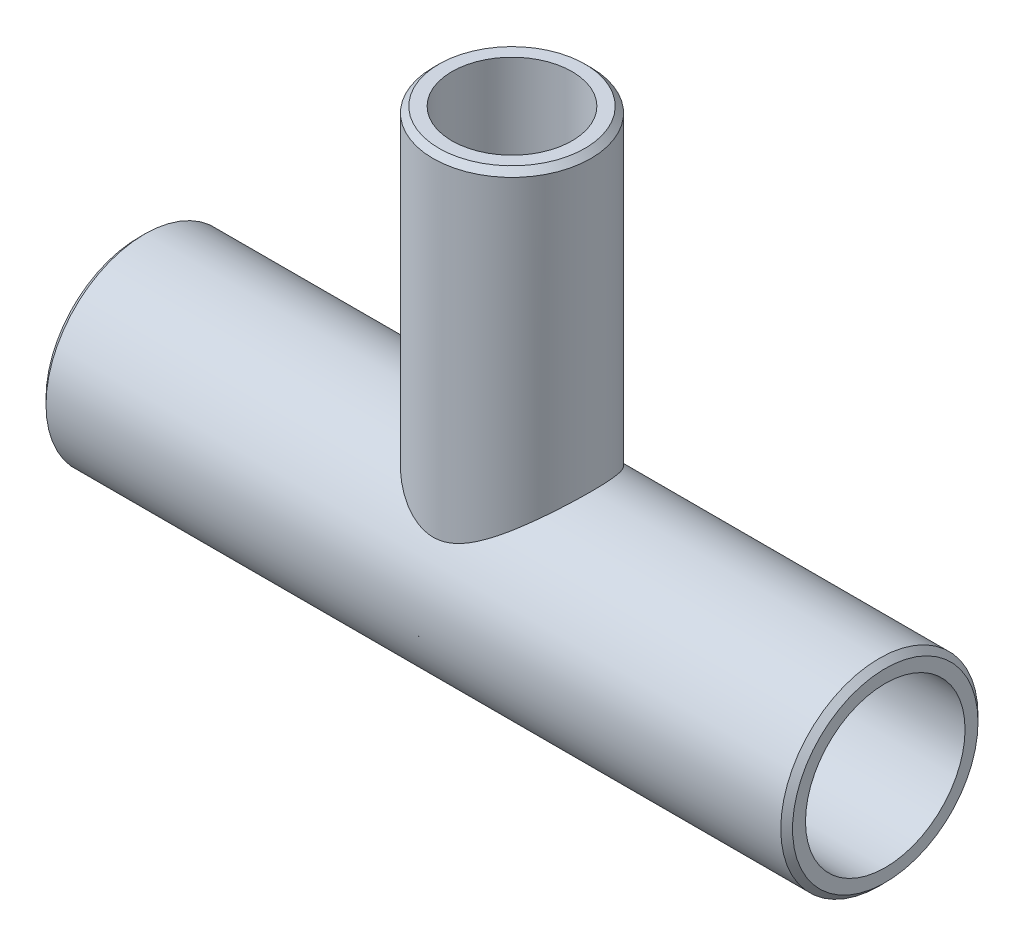
ISO-10303-21;
HEADER;
FILE_DESCRIPTION(('STEP AP214'),'2;1');
FILE_NAME('part.step','',(''),(''),'','','');
FILE_SCHEMA(('AUTOMOTIVE_DESIGN { 1 0 10303 214 1 1 1 1 }'));
ENDSEC;
DATA;
#1=APPLICATION_CONTEXT('core data for automotive mechanical design processes');
#2=APPLICATION_PROTOCOL_DEFINITION('international standard','automotive_design',2000,#1);
#3=PRODUCT_CONTEXT('',#1,'mechanical');
#4=PRODUCT('Part','Part','',(#3));
#5=PRODUCT_RELATED_PRODUCT_CATEGORY('part','',(#4));
#6=PRODUCT_DEFINITION_FORMATION('','',#4);
#7=PRODUCT_DEFINITION_CONTEXT('part definition',#1,'design');
#8=PRODUCT_DEFINITION('design','',#6,#7);
#9=PRODUCT_DEFINITION_SHAPE('','',#8);
#10=(LENGTH_UNIT() NAMED_UNIT(*) SI_UNIT(.MILLI.,.METRE.));
#11=(NAMED_UNIT(*) PLANE_ANGLE_UNIT() SI_UNIT($,.RADIAN.));
#12=(NAMED_UNIT(*) SI_UNIT($,.STERADIAN.) SOLID_ANGLE_UNIT());
#13=UNCERTAINTY_MEASURE_WITH_UNIT(LENGTH_MEASURE(1.E-05),#10,'distance_accuracy_value','');
#14=(GEOMETRIC_REPRESENTATION_CONTEXT(3) GLOBAL_UNCERTAINTY_ASSIGNED_CONTEXT((#13)) GLOBAL_UNIT_ASSIGNED_CONTEXT((#10,
#11,#12)) REPRESENTATION_CONTEXT('',''));
#15=CARTESIAN_POINT('',(0.,0.,0.));
#16=DIRECTION('',(0.,0.,1.));
#17=DIRECTION('',(1.,0.,0.));
#18=AXIS2_PLACEMENT_3D('',#15,#16,#17);
#19=CARTESIAN_POINT('',(-63.4,0.,0.));
#20=DIRECTION('',(-1.,0.,0.));
#21=DIRECTION('',(0.,0.,-1.));
#22=AXIS2_PLACEMENT_3D('',#19,#20,#21);
#23=PLANE('',#22);
#24=CARTESIAN_POINT('',(-63.4,0.,0.));
#25=DIRECTION('',(-1.,0.,0.));
#26=DIRECTION('',(0.,0.,1.));
#27=AXIS2_PLACEMENT_3D('',#24,#25,#26);
#28=CIRCLE('',#27,15.75);
#29=CARTESIAN_POINT('',(-63.4,0.,15.75));
#30=VERTEX_POINT('',#29);
#31=EDGE_CURVE('E10',#30,#30,#28,.T.);
#32=ORIENTED_EDGE('',*,*,#31,.T.);
#33=EDGE_LOOP('',(#32));
#34=FACE_BOUND('',#33,.T.);
#35=CARTESIAN_POINT('',(-63.4,0.,0.));
#36=DIRECTION('',(-1.,0.,0.));
#37=DIRECTION('',(0.,0.,1.));
#38=AXIS2_PLACEMENT_3D('',#35,#36,#37);
#39=CIRCLE('',#38,13.55);
#40=CARTESIAN_POINT('',(-63.4,0.,13.55));
#41=VERTEX_POINT('',#40);
#42=EDGE_CURVE('E93',#41,#41,#39,.F.);
#43=ORIENTED_EDGE('',*,*,#42,.T.);
#44=EDGE_LOOP('',(#43));
#45=FACE_BOUND('',#44,.T.);
#46=ADVANCED_FACE('F32',(#34,#45),#23,.T.);
#47=CARTESIAN_POINT('',(63.4,0.,0.));
#48=DIRECTION('',(-1.,0.,0.));
#49=DIRECTION('',(0.,0.,1.));
#50=AXIS2_PLACEMENT_3D('',#47,#48,#49);
#51=CYLINDRICAL_SURFACE('',#50,16.75);
#52=CARTESIAN_POINT('',(62.4,0.,0.));
#53=DIRECTION('',(1.,0.,0.));
#54=DIRECTION('',(0.,0.,-1.));
#55=AXIS2_PLACEMENT_3D('',#52,#53,#54);
#56=CIRCLE('',#55,16.75);
#57=CARTESIAN_POINT('',(62.4,0.,-16.75));
#58=VERTEX_POINT('',#57);
#59=EDGE_CURVE('E39',#58,#58,#56,.F.);
#60=ORIENTED_EDGE('',*,*,#59,.T.);
#61=EDGE_LOOP('',(#60));
#62=FACE_BOUND('',#61,.T.);
#63=CARTESIAN_POINT('',(-62.4,0.,0.));
#64=DIRECTION('',(-1.,0.,0.));
#65=DIRECTION('',(0.,0.,1.));
#66=AXIS2_PLACEMENT_3D('',#63,#64,#65);
#67=CIRCLE('',#66,16.75);
#68=CARTESIAN_POINT('',(-62.4,0.,16.75));
#69=VERTEX_POINT('',#68);
#70=EDGE_CURVE('E43',#69,#69,#67,.F.);
#71=ORIENTED_EDGE('',*,*,#70,.T.);
#72=EDGE_LOOP('',(#71));
#73=FACE_BOUND('',#72,.T.);
#74=CARTESIAN_POINT('',(0.,10.05,-13.4));
#75=CARTESIAN_POINT('',(-0.251626201327956,10.0500059696271,-13.3999974965364));
#76=CARTESIAN_POINT('',(-0.503344424185759,10.0594974422922,-13.3928931752002));
#77=CARTESIAN_POINT('',(-1.00470312417824,10.0969954885486,-13.3646439441631));
#78=CARTESIAN_POINT('',(-1.25434206688429,10.1250146875142,-13.3434894601971));
#79=CARTESIAN_POINT('',(-1.75019993720332,10.1983037460171,-13.2875587314895));
#80=CARTESIAN_POINT('',(-1.99640782594338,10.2436199241471,-13.2527459048122));
#81=CARTESIAN_POINT('',(-2.48333342225148,10.3495362606591,-13.170197125546));
#82=CARTESIAN_POINT('',(-2.72404915753401,10.4101418182572,-13.1224566072978));
#83=CARTESIAN_POINT('',(-3.28174008964792,10.5677800805383,-12.9960747206795));
#84=CARTESIAN_POINT('',(-3.59608306130681,10.6701486648384,-12.9124619071728));
#85=CARTESIAN_POINT('',(-4.21195782955269,10.8931419567586,-12.7249033542491));
#86=CARTESIAN_POINT('',(-4.51348373617904,11.013774943896,-12.620948387158));
#87=CARTESIAN_POINT('',(-5.10409999543689,11.2686826505591,-12.3938888831368));
#88=CARTESIAN_POINT('',(-5.39316070062919,11.4029875871149,-12.2707415950598));
#89=CARTESIAN_POINT('',(-5.95824456589363,11.6808682767263,-12.0065234584595));
#90=CARTESIAN_POINT('',(-6.23426805661084,11.8244437944459,-11.8654530648305));
#91=CARTESIAN_POINT('',(-6.87111414005598,12.1704358135562,-11.5119171273875));
#92=CARTESIAN_POINT('',(-7.22650518674191,12.3753546615614,-11.292081647162));
#93=CARTESIAN_POINT('',(-7.91393200569303,12.7889621090623,-10.8214246703252));
#94=CARTESIAN_POINT('',(-8.24595932775521,12.9976520385351,-10.5705920521406));
#95=CARTESIAN_POINT('',(-8.88583631319087,13.4127326947903,-10.038667475319));
#96=CARTESIAN_POINT('',(-9.19370518042702,13.6191251335412,-9.75759998094687));
#97=CARTESIAN_POINT('',(-9.784211495649,14.0245237091234,-9.16536698234049));
#98=CARTESIAN_POINT('',(-10.0668573329741,14.2235322889095,-8.85421155782735));
#99=CARTESIAN_POINT('',(-10.5517608231662,14.5711896701934,-8.26652315423908));
#100=CARTESIAN_POINT('',(-10.7588737640696,14.7220251818747,-7.99527914237686));
#101=CARTESIAN_POINT('',(-11.1540762228731,15.0132632332521,-7.43399896403364));
#102=CARTESIAN_POINT('',(-11.3421694185469,15.1536677885432,-7.14396644847578));
#103=CARTESIAN_POINT('',(-11.6974140594319,15.421361351673,-6.54608809294857));
#104=CARTESIAN_POINT('',(-11.864590120815,15.548665744392,-6.23826382710511));
#105=CARTESIAN_POINT('',(-12.1762797151034,15.7877894231551,-5.60557750728794));
#106=CARTESIAN_POINT('',(-12.3207970074786,15.8996112776512,-5.28071829165928));
#107=CARTESIAN_POINT('',(-12.5637136274891,16.088647275363,-4.66938064590777));
#108=CARTESIAN_POINT('',(-12.665791584754,16.1685337740962,-4.38518655897695));
#109=CARTESIAN_POINT('',(-12.8513230676737,16.3142792227322,-3.80730145317628));
#110=CARTESIAN_POINT('',(-12.9347801424423,16.380140845647,-3.51361225629924));
#111=CARTESIAN_POINT('',(-13.0819200760264,16.4965787330713,-2.91844105528547));
#112=CARTESIAN_POINT('',(-13.1456095918879,16.5471601432868,-2.61696171173791));
#113=CARTESIAN_POINT('',(-13.2522878776224,16.6320350068494,-2.00807982203305));
#114=CARTESIAN_POINT('',(-13.2952764003154,16.666328265708,-1.70067720519456));
#115=CARTESIAN_POINT('',(-13.3599599123691,16.7179737769041,-1.08111686591818));
#116=CARTESIAN_POINT('',(-13.3815796141894,16.7352661297969,-0.768946238172296));
#117=CARTESIAN_POINT('',(-13.4028873501474,16.7523087385576,-0.143374668280406));
#118=CARTESIAN_POINT('',(-13.4025753420975,16.7520589606818,0.17002627623107));
#119=CARTESIAN_POINT('',(-13.3800251370482,16.7340230500481,0.795536554559255));
#120=CARTESIAN_POINT('',(-13.3577861976285,16.7162363235099,1.10764584428273));
#121=CARTESIAN_POINT('',(-13.2917644594032,16.6635262613518,1.72809916865212));
#122=CARTESIAN_POINT('',(-13.2479821574947,16.6286033209783,2.03644328997348));
#123=CARTESIAN_POINT('',(-13.142562561036,16.5447421060504,2.63040081156685));
#124=CARTESIAN_POINT('',(-13.082031737964,16.4966740198907,2.91633556978728));
#125=CARTESIAN_POINT('',(-12.9431950941234,16.3867934320311,3.48113020490326));
#126=CARTESIAN_POINT('',(-12.8648900715024,16.3249815474968,3.75999039885606));
#127=CARTESIAN_POINT('',(-12.6914745821485,16.1886736500737,4.30922429009577));
#128=CARTESIAN_POINT('',(-12.5963645071381,16.1141779328442,4.57959818502376));
#129=CARTESIAN_POINT('',(-12.3903465200425,15.9536521770385,5.11082348097406));
#130=CARTESIAN_POINT('',(-12.2794328257439,15.8676179174311,5.37167135254455));
#131=CARTESIAN_POINT('',(-12.0315403323823,15.6765315054163,5.90739392252403));
#132=CARTESIAN_POINT('',(-11.8930819757937,15.5704467956059,6.1812150795797));
#133=CARTESIAN_POINT('',(-11.5997756901007,15.347579682616,6.71551468893196));
#134=CARTESIAN_POINT('',(-11.4449209933821,15.2307928648219,6.97598756536233));
#135=CARTESIAN_POINT('',(-11.1200685236879,14.9882202214986,7.4829628841241));
#136=CARTESIAN_POINT('',(-10.9500682887864,14.8624329335886,7.72946304447869));
#137=CARTESIAN_POINT('',(-10.5960089093844,14.603537992709,8.20812012786858));
#138=CARTESIAN_POINT('',(-10.4119478684388,14.4704293529555,8.44027510843869));
#139=CARTESIAN_POINT('',(-9.9913867078674,14.1705428781178,8.93636532449847));
#140=CARTESIAN_POINT('',(-9.75189595593614,14.0024786951974,9.19699282442354));
#141=CARTESIAN_POINT('',(-9.25499796572565,13.6610716290962,9.69686817492192));
#142=CARTESIAN_POINT('',(-8.99758777777035,13.4877278795125,9.93611249078642));
#143=CARTESIAN_POINT('',(-8.46536983212856,13.1386667013424,10.3933024467624));
#144=CARTESIAN_POINT('',(-8.19054215535919,12.9629467426539,10.611222948847));
#145=CARTESIAN_POINT('',(-7.62418430353866,12.6127364933561,11.0251914267453));
#146=CARTESIAN_POINT('',(-7.33265613500705,12.4382460578401,11.2212420218628));
#147=CARTESIAN_POINT('',(-6.76179965485148,12.1109519033706,11.5732193564375));
#148=CARTESIAN_POINT('',(-6.48400198481565,11.9576784518053,11.731192015032));
#149=CARTESIAN_POINT('',(-5.91452185297866,11.6587013168111,12.0283662016003));
#150=CARTESIAN_POINT('',(-5.62283780805685,11.5129985004543,12.1675655823534));
#151=CARTESIAN_POINT('',(-5.02589076695029,11.2335489321028,12.4260226066466));
#152=CARTESIAN_POINT('',(-4.72065193232101,11.0997820916303,12.54531406187));
#153=CARTESIAN_POINT('',(-4.09614670123369,10.8489294437068,12.7628676576986));
#154=CARTESIAN_POINT('',(-3.77688680119439,10.7318360154128,12.861139416064));
#155=CARTESIAN_POINT('',(-3.22359798619178,10.5521502083132,13.0086039529131));
#156=CARTESIAN_POINT('',(-2.99299640045556,10.4837853501271,13.0636510823416));
#157=CARTESIAN_POINT('',(-2.52587929865695,10.3601103742903,13.1619473100628));
#158=CARTESIAN_POINT('',(-2.28936572733034,10.3047960246077,13.2052002337029));
#159=CARTESIAN_POINT('',(-1.81178644375052,10.2093320053718,13.2791451634812));
#160=CARTESIAN_POINT('',(-1.57072982844974,10.1691548402061,13.3098599528011));
#161=CARTESIAN_POINT('',(-1.08509197791978,10.1055434188978,13.3582222904744));
#162=CARTESIAN_POINT('',(-0.840510820301541,10.0821087946551,13.375870126117));
#163=CARTESIAN_POINT('',(-0.348227093352013,10.0530121632059,13.397753165142));
#164=CARTESIAN_POINT('',(-0.100514622352647,10.0474557697537,13.4019086652884));
#165=CARTESIAN_POINT('',(0.394481434747978,10.0546937816312,13.3964790383235));
#166=CARTESIAN_POINT('',(0.641765027637723,10.0674878937968,13.3868941307265));
#167=CARTESIAN_POINT('',(1.13414922883296,10.1108140990256,13.3542002496525));
#168=CARTESIAN_POINT('',(1.37924686261634,10.1413674519222,13.3310750666802));
#169=CARTESIAN_POINT('',(1.8652382418232,10.218806505917,13.2718066647909));
#170=CARTESIAN_POINT('',(2.10613133477562,10.2656947186477,13.2356614438963));
#171=CARTESIAN_POINT('',(2.64298216410332,10.3876490342133,13.1402687677967));
#172=CARTESIAN_POINT('',(2.93737222473333,10.4668480972873,13.0774844020582));
#173=CARTESIAN_POINT('',(3.51600875063545,10.643720960358,12.9339337454107));
#174=CARTESIAN_POINT('',(3.80025201868997,10.7414005234692,12.8531618437224));
#175=CARTESIAN_POINT('',(4.35861626092497,10.9513893174153,12.6747223018417));
#176=CARTESIAN_POINT('',(4.63271068063135,11.0637338644349,12.5770136821728));
#177=CARTESIAN_POINT('',(5.16992366498524,11.2992185373404,12.365888311948));
#178=CARTESIAN_POINT('',(5.43304173494389,11.4223591490158,12.2524708544096));
#179=CARTESIAN_POINT('',(6.06650276832589,11.734472388534,11.95532779676));
#180=CARTESIAN_POINT('',(6.43078557004997,11.9277738733819,11.7631860607516));
#181=CARTESIAN_POINT('',(7.13692443060922,12.3228499276602,11.3486560416243));
#182=CARTESIAN_POINT('',(7.4787711948554,12.5246279526057,11.1262553388948));
#183=CARTESIAN_POINT('',(8.14034594803135,12.9305644522446,10.6517881857084));
#184=CARTESIAN_POINT('',(8.46005179285428,13.1347250781244,10.3996926976403));
#185=CARTESIAN_POINT('',(9.0763151256699,13.5398726638361,9.86643261807698));
#186=CARTESIAN_POINT('',(9.37287622582702,13.7408601149791,9.58527257862707));
#187=CARTESIAN_POINT('',(9.94564987369515,14.1377238342114,8.98983396720933));
#188=CARTESIAN_POINT('',(10.2215095904755,14.333485459228,8.67513824930516));
#189=CARTESIAN_POINT('',(10.7459394709305,14.7120636001677,8.0163589826514));
#190=CARTESIAN_POINT('',(10.9945053637884,14.8948780885958,7.6722708496407));
#191=CARTESIAN_POINT('',(11.4606981701603,15.2422446250347,6.95659908826972));
#192=CARTESIAN_POINT('',(11.6784082194385,15.4068454733279,6.58509360845625));
#193=CARTESIAN_POINT('',(12.0800559266746,15.7134793736264,5.81552660545272));
#194=CARTESIAN_POINT('',(12.2640127062655,15.8555251971463,5.41748029331761));
#195=CARTESIAN_POINT('',(12.5410012871159,16.0709147212799,4.73000754558143));
#196=CARTESIAN_POINT('',(12.6442238835197,16.151641322483,4.44694973242837));
#197=CARTESIAN_POINT('',(12.8321830763186,16.2992032210472,3.87126452604658));
#198=CARTESIAN_POINT('',(12.9169244873548,16.3660421361551,3.5786396480875));
#199=CARTESIAN_POINT('',(13.066752079623,16.4845506734231,2.98554743892361));
#200=CARTESIAN_POINT('',(13.1318486678015,16.5362283269348,2.68508435203379));
#201=CARTESIAN_POINT('',(13.2414749809537,16.6234188406989,2.07808683083183));
#202=CARTESIAN_POINT('',(13.2860039747852,16.6589311263,1.77155218109006));
#203=CARTESIAN_POINT('',(13.3538915981246,16.7131235920091,1.15350595926598));
#204=CARTESIAN_POINT('',(13.3771715150053,16.7317411879115,0.841980197703478));
#205=CARTESIAN_POINT('',(13.4018778953395,16.7515006999598,0.2175067905842));
#206=CARTESIAN_POINT('',(13.403304445552,16.7526426854849,-0.0954408493227148));
#207=CARTESIAN_POINT('',(13.3842791468042,16.7374250170472,-0.720258413616824));
#208=CARTESIAN_POINT('',(13.3638258967826,16.7210642423045,-1.03212826770558));
#209=CARTESIAN_POINT('',(13.3013912546559,16.6712074044913,-1.65230729060479));
#210=CARTESIAN_POINT('',(13.259410333875,16.6377117165706,-1.96061653721964));
#211=CARTESIAN_POINT('',(13.1574298619161,16.5565565017634,-2.55500386384212));
#212=CARTESIAN_POINT('',(13.0985175313709,16.5097530290439,-2.84138738347587));
#213=CARTESIAN_POINT('',(12.9628501931623,16.4023251136888,-3.40722144782388));
#214=CARTESIAN_POINT('',(12.8860959700909,16.3417012788018,-3.68667229680242));
#215=CARTESIAN_POINT('',(12.7157031555061,16.2076784152241,-4.23720816282997));
#216=CARTESIAN_POINT('',(12.6220648454331,16.1342795994798,-4.5082933192382));
#217=CARTESIAN_POINT('',(12.4189072505468,15.9758478296062,-5.04103736459011));
#218=CARTESIAN_POINT('',(12.3093821423394,15.8908106100033,-5.30269275290114));
#219=CARTESIAN_POINT('',(12.0646958443694,15.7019991644632,-5.83934492811912));
#220=CARTESIAN_POINT('',(11.9280998203403,15.5972190182437,-6.11333294082741));
#221=CARTESIAN_POINT('',(11.6385181480375,15.3768908554179,-6.64811359019823));
#222=CARTESIAN_POINT('',(11.4855257408469,15.2613384008247,-6.90890071946825));
#223=CARTESIAN_POINT('',(11.1644012848961,15.021151494553,-7.41662913947793));
#224=CARTESIAN_POINT('',(10.996267216453,14.8965158317275,-7.66356857598219));
#225=CARTESIAN_POINT('',(10.6459433302212,14.63982242044,-8.14322498433479));
#226=CARTESIAN_POINT('',(10.4637516114379,14.5077636688229,-8.37594002498712));
#227=CARTESIAN_POINT('',(10.0475913120817,14.2102523923731,-8.87307262703753));
#228=CARTESIAN_POINT('',(9.81065684682822,14.0434964539243,-9.13423228018213));
#229=CARTESIAN_POINT('',(9.31894870012925,13.7045090307572,-9.63537591043568));
#230=CARTESIAN_POINT('',(9.06417215024749,13.5322766680462,-9.87535646854212));
#231=CARTESIAN_POINT('',(8.53732046011871,13.1851809580771,-10.3342318023186));
#232=CARTESIAN_POINT('',(8.26522525427812,13.0103147450068,-10.5531013522322));
#233=CARTESIAN_POINT('',(7.70446069927766,12.6614765729201,-10.9691924508521));
#234=CARTESIAN_POINT('',(7.41579318846488,12.4875045170396,-11.1664163936411));
#235=CARTESIAN_POINT('',(6.84591595478028,12.1581028626866,-11.5237677151429));
#236=CARTESIAN_POINT('',(6.56598804320681,12.0023107843454,-11.6856048646804));
#237=CARTESIAN_POINT('',(5.99191387282969,11.6981301515265,-11.9901020830426));
#238=CARTESIAN_POINT('',(5.69776571971768,11.5497425887999,-12.1327595872827));
#239=CARTESIAN_POINT('',(5.09545265532568,11.2648045861488,-12.3977609388362));
#240=CARTESIAN_POINT('',(4.78730769556661,11.1282380564283,-12.520132612088));
#241=CARTESIAN_POINT('',(4.15662348270329,10.871850689408,-12.7434002997371));
#242=CARTESIAN_POINT('',(3.83409156626134,10.7520214428302,-12.8443071121035));
#243=CARTESIAN_POINT('',(3.27272121972974,10.5671786705405,-12.9964244668858));
#244=CARTESIAN_POINT('',(3.03735320484976,10.4964363566049,-13.0535054820399));
#245=CARTESIAN_POINT('',(2.56038850898627,10.3684794657897,-13.1553725507009));
#246=CARTESIAN_POINT('',(2.31879404564717,10.3112601443626,-13.2001629172781));
#247=CARTESIAN_POINT('',(1.83110436660265,10.2126687242829,-13.2765880868997));
#248=CARTESIAN_POINT('',(1.58502516274055,10.1712487276284,-13.3082626777595));
#249=CARTESIAN_POINT('',(1.0892852996073,10.1058796786049,-13.3579718458217));
#250=CARTESIAN_POINT('',(0.839627273179483,10.0819183936063,-13.3760159736776));
#251=CARTESIAN_POINT('',(0.491171313027627,10.061517385758,-13.3913554846336));
#252=CARTESIAN_POINT('',(0.393026253094125,10.0572030963687,-13.3945951614451));
#253=CARTESIAN_POINT('',(0.196592155056548,10.0514430506664,-13.3989180485307));
#254=CARTESIAN_POINT('',(0.0983030998731885,10.0499976678388,-13.400000978031));
#255=CARTESIAN_POINT('',(0.,10.05,-13.4));
#256=B_SPLINE_CURVE_WITH_KNOTS('',3,(#74,#75,#76,#77,#78,#79,#80,#81,#82,#83,#84,#85,#86,#87,
#88,#89,#90,#91,#92,#93,#94,#95,#96,#97,#98,#99,#100,#101,#102,#103,#104,#105,#106,#107,#108,
#109,#110,#111,#112,#113,#114,#115,#116,#117,#118,#119,#120,#121,#122,#123,#124,#125,#126,#127,
#128,#129,#130,#131,#132,#133,#134,#135,#136,#137,#138,#139,#140,#141,#142,#143,#144,#145,#146,
#147,#148,#149,#150,#151,#152,#153,#154,#155,#156,#157,#158,#159,#160,#161,#162,#163,#164,#165,
#166,#167,#168,#169,#170,#171,#172,#173,#174,#175,#176,#177,#178,#179,#180,#181,#182,#183,#184,
#185,#186,#187,#188,#189,#190,#191,#192,#193,#194,#195,#196,#197,#198,#199,#200,#201,#202,#203,
#204,#205,#206,#207,#208,#209,#210,#211,#212,#213,#214,#215,#216,#217,#218,#219,#220,#221,#222,
#223,#224,#225,#226,#227,#228,#229,#230,#231,#232,#233,#234,#235,#236,#237,#238,#239,#240,#241,
#242,#243,#244,#245,#246,#247,#248,#249,#250,#251,#252,#253,#254,#255),.UNSPECIFIED.,.T.,.F.,(4,
2,2,2,2,2,2,2,2,2,2,2,2,2,2,2,2,2,2,2,2,2,2,2,2,2,2,2,2,2,2,2,2,2,2,2,2,2,2,2,2,2,2,2,2,2,2,2,2,
2,2,2,2,2,2,2,2,2,2,2,2,2,2,2,2,2,2,2,2,2,2,2,2,2,2,2,2,2,2,2,2,2,2,2,2,2,2,2,2,2,4),(0.,
0.754765552181555,1.51004595605082,2.2673632348963,3.02494832430723,4.04632963256126,
5.06817534170432,6.09233064530915,7.11645996069881,8.51094628738255,9.90593440740347,
11.299802157448,12.6932045567379,13.8115695529304,14.9297178800535,16.0465376922077,
17.1631720086837,18.0993058871004,19.0352611870178,19.9709009459441,20.9065518765903,
21.8454877052267,22.7844253399896,23.7233947671662,24.6623425380438,25.5499795121733,
26.4375766349886,27.3251530708113,28.2130550901553,29.1861006422768,30.1595493977124,
31.1331566781579,32.1068955061018,33.2812662903811,34.4558308442573,35.6317637852545,
36.8075557361633,37.8700668758503,38.9326994388994,39.9935084394943,41.0538310136658,
41.7934509543285,42.5328307196297,43.2708609042501,44.0088748620963,44.7512406307188,
45.493594539577,46.2368389662295,46.9801977239126,47.9125090682504,48.8451116330495,
49.7800030166115,50.7149364890119,52.077904965791,53.4414345619477,54.8063087569543,
56.1709695104052,57.5552018244841,58.9396504293772,60.3202949208312,61.7001548292633,
62.635017105615,63.5696355438572,64.5037579904732,65.4379136409635,66.3755157901205,
67.313114216946,68.2507726859807,69.1884106269135,70.0757573443289,70.9630650483132,
71.8503579631653,72.7379769459595,73.7078034869718,74.6780313588843,75.6483888376638,
76.6188777671627,77.7879672624685,78.9572451433589,80.1279033329225,81.2984319126758,
82.3743879269556,83.4504876686932,84.5250988938073,85.5991682470549,86.3554660594633,
87.1114981292322,87.8652196055628,88.618412469851,88.9132392242068,89.2081043577476),.UNSPECIFIED.);
#257=CARTESIAN_POINT('',(0.,10.05,-13.4));
#258=VERTEX_POINT('',#257);
#259=EDGE_CURVE('E58',#258,#258,#256,.T.);
#260=ORIENTED_EDGE('',*,*,#259,.F.);
#261=EDGE_LOOP('',(#260));
#262=FACE_BOUND('',#261,.T.);
#263=ADVANCED_FACE('F68',(#62,#73,#262),#51,.T.);
#264=CARTESIAN_POINT('',(63.4,0.,0.));
#265=DIRECTION('',(1.,0.,0.));
#266=DIRECTION('',(0.,0.,-1.));
#267=AXIS2_PLACEMENT_3D('',#264,#265,#266);
#268=PLANE('',#267);
#269=CARTESIAN_POINT('',(63.4,0.,0.));
#270=DIRECTION('',(1.,0.,0.));
#271=DIRECTION('',(0.,0.,-1.));
#272=AXIS2_PLACEMENT_3D('',#269,#270,#271);
#273=CIRCLE('',#272,15.75);
#274=CARTESIAN_POINT('',(63.4,0.,-15.75));
#275=VERTEX_POINT('',#274);
#276=EDGE_CURVE('E47',#275,#275,#273,.T.);
#277=ORIENTED_EDGE('',*,*,#276,.T.);
#278=EDGE_LOOP('',(#277));
#279=FACE_BOUND('',#278,.T.);
#280=CARTESIAN_POINT('',(63.4,0.,0.));
#281=DIRECTION('',(1.,0.,0.));
#282=DIRECTION('',(0.,0.,-1.));
#283=AXIS2_PLACEMENT_3D('',#280,#281,#282);
#284=CIRCLE('',#283,13.55);
#285=CARTESIAN_POINT('',(63.4,0.,-13.55));
#286=VERTEX_POINT('',#285);
#287=EDGE_CURVE('E91',#286,#286,#284,.T.);
#288=ORIENTED_EDGE('',*,*,#287,.F.);
#289=EDGE_LOOP('',(#288));
#290=FACE_BOUND('',#289,.T.);
#291=ADVANCED_FACE('F78',(#279,#290),#268,.T.);
#292=CARTESIAN_POINT('',(0.,66.75,0.));
#293=DIRECTION('',(0.,-1.,0.));
#294=DIRECTION('',(0.,0.,-1.));
#295=AXIS2_PLACEMENT_3D('',#292,#293,#294);
#296=CYLINDRICAL_SURFACE('',#295,13.4);
#297=CARTESIAN_POINT('',(0.,65.75,0.));
#298=DIRECTION('',(0.,1.,0.));
#299=DIRECTION('',(0.,0.,1.));
#300=AXIS2_PLACEMENT_3D('',#297,#298,#299);
#301=CIRCLE('',#300,13.4);
#302=CARTESIAN_POINT('',(0.,65.75,13.4));
#303=VERTEX_POINT('',#302);
#304=EDGE_CURVE('E52',#303,#303,#301,.F.);
#305=ORIENTED_EDGE('',*,*,#304,.T.);
#306=EDGE_LOOP('',(#305));
#307=FACE_BOUND('',#306,.T.);
#308=ORIENTED_EDGE('',*,*,#259,.T.);
#309=EDGE_LOOP('',(#308));
#310=FACE_BOUND('',#309,.T.);
#311=ADVANCED_FACE('F72',(#307,#310),#296,.T.);
#312=CARTESIAN_POINT('',(0.,66.75,0.));
#313=DIRECTION('',(0.,1.,0.));
#314=DIRECTION('',(0.,0.,1.));
#315=AXIS2_PLACEMENT_3D('',#312,#313,#314);
#316=PLANE('',#315);
#317=CARTESIAN_POINT('',(0.,66.75,0.));
#318=DIRECTION('',(0.,1.,0.));
#319=DIRECTION('',(0.,0.,1.));
#320=AXIS2_PLACEMENT_3D('',#317,#318,#319);
#321=CIRCLE('',#320,12.4);
#322=CARTESIAN_POINT('',(0.,66.75,12.4));
#323=VERTEX_POINT('',#322);
#324=EDGE_CURVE('E55',#323,#323,#321,.T.);
#325=ORIENTED_EDGE('',*,*,#324,.T.);
#326=EDGE_LOOP('',(#325));
#327=FACE_BOUND('',#326,.T.);
#328=CARTESIAN_POINT('',(0.,66.75,0.));
#329=DIRECTION('',(0.,1.,0.));
#330=DIRECTION('',(0.,0.,1.));
#331=AXIS2_PLACEMENT_3D('',#328,#329,#330);
#332=CIRCLE('',#331,10.2);
#333=CARTESIAN_POINT('',(0.,66.75,10.2));
#334=VERTEX_POINT('',#333);
#335=EDGE_CURVE('E66',#334,#334,#332,.T.);
#336=ORIENTED_EDGE('',*,*,#335,.F.);
#337=EDGE_LOOP('',(#336));
#338=FACE_BOUND('',#337,.T.);
#339=ADVANCED_FACE('F77',(#327,#338),#316,.T.);
#340=CARTESIAN_POINT('',(63.4,0.,0.));
#341=DIRECTION('',(-1.,0.,0.));
#342=DIRECTION('',(0.,0.,1.));
#343=AXIS2_PLACEMENT_3D('',#340,#341,#342);
#344=CYLINDRICAL_SURFACE('',#343,13.55);
#345=ORIENTED_EDGE('',*,*,#42,.F.);
#346=EDGE_LOOP('',(#345));
#347=FACE_BOUND('',#346,.T.);
#348=ORIENTED_EDGE('',*,*,#287,.T.);
#349=EDGE_LOOP('',(#348));
#350=FACE_BOUND('',#349,.T.);
#351=CARTESIAN_POINT('',(-0.501294025122301,8.93385670914994,10.1876741359535));
#352=CARTESIAN_POINT('',(-0.274875456408806,8.92115577845845,10.1988134941594));
#353=CARTESIAN_POINT('',(-0.0475759035484044,8.91702233495613,10.2024143637438));
#354=CARTESIAN_POINT('',(0.406502205872749,8.9261508148422,10.1944278412873));
#355=CARTESIAN_POINT('',(0.633280446063563,8.93942141477717,10.1828328735727));
#356=CARTESIAN_POINT('',(1.08441080599918,8.98264495445942,10.1447232267389));
#357=CARTESIAN_POINT('',(1.30875710839563,9.01263149478853,10.1181784961069));
#358=CARTESIAN_POINT('',(1.75267174874206,9.08770956993393,10.0507990028149));
#359=CARTESIAN_POINT('',(1.97224020729266,9.13280072301285,10.0099646012952));
#360=CARTESIAN_POINT('',(2.40249372594291,9.23533175119868,9.9154390487222));
#361=CARTESIAN_POINT('',(2.61325650808578,9.2926062219388,9.86191910597224));
#362=CARTESIAN_POINT('',(3.0281293812045,9.41769133656268,9.74253868483263));
#363=CARTESIAN_POINT('',(3.23223612247898,9.48550718941987,9.67667210207864));
#364=CARTESIAN_POINT('',(3.63337668585686,9.62958211731102,9.53330865766461));
#365=CARTESIAN_POINT('',(3.8304062160086,9.7058462049764,9.45580488145565));
#366=CARTESIAN_POINT('',(4.21701243813907,9.86481926649798,9.2898360253262));
#367=CARTESIAN_POINT('',(4.40659060769651,9.94752695281154,9.20137313315277));
#368=CARTESIAN_POINT('',(4.87121270502673,10.1602017606554,8.96709431504641));
#369=CARTESIAN_POINT('',(5.14161494989572,10.2931284804765,8.81471162610742));
#370=CARTESIAN_POINT('',(5.66553351989053,10.5645909080455,8.48747153050773));
#371=CARTESIAN_POINT('',(5.91904328522747,10.7031287615516,8.31260546930288));
#372=CARTESIAN_POINT('',(6.40919618196631,10.981785080324,7.94084068279421));
#373=CARTESIAN_POINT('',(6.64581186368401,11.1219057079343,7.74390737876722));
#374=CARTESIAN_POINT('',(7.10101925135354,11.3997586556147,7.3287378535691));
#375=CARTESIAN_POINT('',(7.31961346219351,11.537491305492,7.11050460221684));
#376=CARTESIAN_POINT('',(7.73944750338353,11.8082859499175,6.65120638356544));
#377=CARTESIAN_POINT('',(7.94052766587684,11.941299501405,6.40996642785767));
#378=CARTESIAN_POINT('',(8.32167770874869,12.1980733912912,5.90671641892064));
#379=CARTESIAN_POINT('',(8.50174493832411,12.3218325615345,5.64470375217907));
#380=CARTESIAN_POINT('',(8.83834068028492,12.5564424816306,5.10152495435374));
#381=CARTESIAN_POINT('',(8.99492748012695,12.6673250363316,4.82040885647632));
#382=CARTESIAN_POINT('',(9.28264346990947,12.8732231143326,4.23996642700025));
#383=CARTESIAN_POINT('',(9.41378483483146,12.9682462229086,3.94064889480765));
#384=CARTESIAN_POINT('',(9.61372296617789,13.1142284677829,3.41619802334704));
#385=CARTESIAN_POINT('',(9.68952763463622,13.1699401401113,3.19502978155116));
#386=CARTESIAN_POINT('',(9.82626672486213,13.2708660027673,2.74582626235324));
#387=CARTESIAN_POINT('',(9.88720465898058,13.3160826724763,2.51779262127098));
#388=CARTESIAN_POINT('',(9.99338621137987,13.3951114859231,2.05627631929664));
#389=CARTESIAN_POINT('',(10.0386378433331,13.4289294526795,1.8227965059564));
#390=CARTESIAN_POINT('',(10.1128339266252,13.4844838294629,1.35181929823214));
#391=CARTESIAN_POINT('',(10.1417778202307,13.5062198262798,1.11432176672613));
#392=CARTESIAN_POINT('',(10.1829635548837,13.5371733032809,0.636360531979776));
#393=CARTESIAN_POINT('',(10.1951561820148,13.5463538963069,0.395890174097201));
#394=CARTESIAN_POINT('',(10.202481717337,13.5518680356405,-0.085458012530116));
#395=CARTESIAN_POINT('',(10.197614687492,13.5482016286109,-0.326335839791674));
#396=CARTESIAN_POINT('',(10.1708994660177,13.5281047817341,-0.806638646206755));
#397=CARTESIAN_POINT('',(10.1490490406445,13.5116726628747,-1.04606343007353));
#398=CARTESIAN_POINT('',(10.0887139361438,13.4664119671484,-1.52161055533595));
#399=CARTESIAN_POINT('',(10.050229459461,13.4375835411507,-1.75773293688737));
#400=CARTESIAN_POINT('',(9.95914980386118,13.3696031186586,-2.21528088699629));
#401=CARTESIAN_POINT('',(9.9072087976837,13.3309308892861,-2.43690905647713));
#402=CARTESIAN_POINT('',(9.7892329686502,13.2434894854799,-2.87441674354555));
#403=CARTESIAN_POINT('',(9.72319325492065,13.1947168073541,-3.09029423690489));
#404=CARTESIAN_POINT('',(9.57781112909616,13.0879537233947,-3.51509975389584));
#405=CARTESIAN_POINT('',(9.49847196690303,13.0299655696678,-3.72402946040288));
#406=CARTESIAN_POINT('',(9.32725669644288,12.9056867203022,-4.13421082012186));
#407=CARTESIAN_POINT('',(9.23537601928407,12.83939299966,-4.3354596408282));
#408=CARTESIAN_POINT('',(9.03000189417142,12.6924299241113,-4.74949855361515));
#409=CARTESIAN_POINT('',(8.91526214174988,12.6109846720074,-4.96139474529048));
#410=CARTESIAN_POINT('',(8.67255069437047,12.4405853457921,-5.37440902904297));
#411=CARTESIAN_POINT('',(8.54457346194821,12.3516281321789,-5.57552255669905));
#412=CARTESIAN_POINT('',(8.27629140364279,12.1675785195132,-5.96650955139329));
#413=CARTESIAN_POINT('',(8.13598184909227,12.0724837708492,-6.15637865978794));
#414=CARTESIAN_POINT('',(7.84385880451965,11.8775748369009,-6.5245003589527));
#415=CARTESIAN_POINT('',(7.69204389171644,11.7777600685029,-6.70275150793092));
#416=CARTESIAN_POINT('',(7.34676878460321,11.5549492662552,-7.08115949454516));
#417=CARTESIAN_POINT('',(7.15097448792225,11.4312408409423,-7.27877222651557));
#418=CARTESIAN_POINT('',(6.7446915725914,11.1815771007225,-7.65677144427897));
#419=CARTESIAN_POINT('',(6.53420029477764,11.0556213822921,-7.83715479866125));
#420=CARTESIAN_POINT('',(6.09893641828753,10.8040708199732,-8.1804560354665));
#421=CARTESIAN_POINT('',(5.87415402766265,10.6784762865109,-8.3433617326507));
#422=CARTESIAN_POINT('',(5.41075355961861,10.4307430090451,-8.6510744378019));
#423=CARTESIAN_POINT('',(5.17213809387774,10.3086036191495,-8.79588484596543));
#424=CARTESIAN_POINT('',(4.72282627359524,10.0913713994392,-9.04373243229949));
#425=CARTESIAN_POINT('',(4.51425762058301,9.9952044955135,-9.14968911005553));
#426=CARTESIAN_POINT('',(4.0876952813384,9.80993609306185,-9.34805146207707));
#427=CARTESIAN_POINT('',(3.86970148711075,9.72083467552694,-9.4404569810172));
#428=CARTESIAN_POINT('',(3.42488805003038,9.55248980040078,-9.6107624987791));
#429=CARTESIAN_POINT('',(3.19808461020022,9.47322927450009,-9.68868773261303));
#430=CARTESIAN_POINT('',(2.73585021015258,9.32734471680866,-9.82921219516323));
#431=CARTESIAN_POINT('',(2.50042288915801,9.26071542637652,-9.89181780492257));
#432=CARTESIAN_POINT('',(2.07354641692887,9.15581789679791,-9.98886620605447));
#433=CARTESIAN_POINT('',(1.88355570395331,9.11453214717654,-10.0264707143716));
#434=CARTESIAN_POINT('',(1.49979696599636,9.04303033428886,-10.0910073766516));
#435=CARTESIAN_POINT('',(1.30603118163644,9.01280790346344,-10.1179456703493));
#436=CARTESIAN_POINT('',(0.915944822589754,8.96459950974725,-10.1606840339746));
#437=CARTESIAN_POINT('',(0.719626956856586,8.94660150464658,-10.1764950658594));
#438=CARTESIAN_POINT('',(0.325635012034898,8.92355721356029,-10.1967085952351));
#439=CARTESIAN_POINT('',(0.127960926285315,8.91851099123298,-10.2011110366525));
#440=CARTESIAN_POINT('',(-0.267472443629391,8.92159728728856,-10.1984119138804));
#441=CARTESIAN_POINT('',(-0.465231479991297,8.92974768127879,-10.1912947456941));
#442=CARTESIAN_POINT('',(-0.859041906314388,8.95889955738607,-10.1656770329975));
#443=CARTESIAN_POINT('',(-1.05509329814127,8.97990102546085,-10.1471765009258));
#444=CARTESIAN_POINT('',(-1.44435344802024,9.0339057340356,-10.099126026094));
#445=CARTESIAN_POINT('',(-1.63755906121555,9.06692134705383,-10.0695646917068));
#446=CARTESIAN_POINT('',(-2.01996410512772,9.14372047815411,-9.99987785964824));
#447=CARTESIAN_POINT('',(-2.20916109068018,9.18751037393964,-9.95974610395106));
#448=CARTESIAN_POINT('',(-2.64692419755206,9.30107324943177,-9.85395599479063));
#449=CARTESIAN_POINT('',(-2.89354625193953,9.3746037598635,-9.78426488573097));
#450=CARTESIAN_POINT('',(-3.37700314941979,9.5349120912051,-9.62810772214079));
#451=CARTESIAN_POINT('',(-3.61383323682314,9.62169625520538,-9.54163363001598));
#452=CARTESIAN_POINT('',(-4.07769899614791,9.80533820260445,-9.35281878951569));
#453=CARTESIAN_POINT('',(-4.30471098195463,9.90221861277658,-9.25044213872795));
#454=CARTESIAN_POINT('',(-4.74818494070208,10.1029038461141,-9.03083449653142));
#455=CARTESIAN_POINT('',(-4.96464690270919,10.2067086764553,-8.91360348972866));
#456=CARTESIAN_POINT('',(-5.44636301960634,10.4484714358273,-8.62993168340827));
#457=CARTESIAN_POINT('',(-5.70823295350441,10.5878289314537,-8.45892024464778));
#458=CARTESIAN_POINT('',(-6.21439777976674,10.8690842584588,-8.09435364329071));
#459=CARTESIAN_POINT('',(-6.45868766624085,11.0109827991443,-7.90079210035625));
#460=CARTESIAN_POINT('',(-6.92885524576,11.2931940554562,-7.49185857662635));
#461=CARTESIAN_POINT('',(-7.15474795887729,11.4335079825296,-7.27650471661687));
#462=CARTESIAN_POINT('',(-7.58726418819869,11.7090269291107,-6.8243136240783));
#463=CARTESIAN_POINT('',(-7.7938928262636,11.844233300877,-6.58748213516681));
#464=CARTESIAN_POINT('',(-8.15206768421887,12.0832193547584,-6.13609417452927));
#465=CARTESIAN_POINT('',(-8.30692814410219,12.1883606132989,-5.92488261350311));
#466=CARTESIAN_POINT('',(-8.60141351287769,12.3909399786454,-5.48861739391888));
#467=CARTESIAN_POINT('',(-8.74104143078618,12.48837960577,-5.26356648295249));
#468=CARTESIAN_POINT('',(-9.00374800975354,12.6736463909088,-4.80035163095062));
#469=CARTESIAN_POINT('',(-9.12683420030569,12.7614779189451,-4.56219372603868));
#470=CARTESIAN_POINT('',(-9.35511609745667,12.9257268104304,-4.07363357602088));
#471=CARTESIAN_POINT('',(-9.46031165303542,13.0021440775277,-3.82323122757906));
#472=CARTESIAN_POINT('',(-9.65223574685861,13.1424436550219,-3.30912730602438));
#473=CARTESIAN_POINT('',(-9.73878024217427,13.2062005932991,-3.04532236010629));
#474=CARTESIAN_POINT('',(-9.89066272456132,13.3185997110259,-2.50850234143708));
#475=CARTESIAN_POINT('',(-9.95600047527858,13.3672417220159,-2.23548716607322));
#476=CARTESIAN_POINT('',(-10.0641503022322,13.4479859882858,-1.68287510973021));
#477=CARTESIAN_POINT('',(-10.106983178136,13.4801035154078,-1.40328455653966));
#478=CARTESIAN_POINT('',(-10.1692911862458,13.5268826567261,-0.840082982437567));
#479=CARTESIAN_POINT('',(-10.1887705472963,13.541547431256,-0.556472698831113));
#480=CARTESIAN_POINT('',(-10.2027890042936,13.5520993559543,-0.031901735788267));
#481=CARTESIAN_POINT('',(-10.2006958259881,13.5505221110899,0.208926971579299));
#482=CARTESIAN_POINT('',(-10.1795158023446,13.5345849777941,0.689390338162193));
#483=CARTESIAN_POINT('',(-10.1604310319226,13.5202266501152,0.92902513957762));
#484=CARTESIAN_POINT('',(-10.1055759521915,13.4790518418672,1.40527581066922));
#485=CARTESIAN_POINT('',(-10.0698060162744,13.4522356400888,1.64189174778183));
#486=CARTESIAN_POINT('',(-9.98212734858252,13.3867291623912,2.11043664024649));
#487=CARTESIAN_POINT('',(-9.93021818873496,13.3480385715189,2.34236547110511));
#488=CARTESIAN_POINT('',(-9.81290694037006,13.2610010218742,2.79271648898002));
#489=CARTESIAN_POINT('',(-9.74799009097141,13.2130029100176,3.01133336872033));
#490=CARTESIAN_POINT('',(-9.6044739881371,13.1074808608647,3.44173830886258));
#491=CARTESIAN_POINT('',(-9.52587002903419,13.0499536477688,3.65352399090159));
#492=CARTESIAN_POINT('',(-9.35584669232225,12.9263668447811,4.06921993018369));
#493=CARTESIAN_POINT('',(-9.26443110018979,12.8603097756732,4.27313249109405));
#494=CARTESIAN_POINT('',(-9.06956358139644,12.7206472233232,4.67251667638249));
#495=CARTESIAN_POINT('',(-8.96610734248437,12.6470390368412,4.86798524203982));
#496=CARTESIAN_POINT('',(-8.73376431216915,12.4833281223593,5.27476405496425));
#497=CARTESIAN_POINT('',(-8.60332027064869,12.3923256379029,5.4848229844713));
#498=CARTESIAN_POINT('',(-8.32908842310553,12.2035371070648,5.89294199154633));
#499=CARTESIAN_POINT('',(-8.1852949316194,12.1057481748871,6.09099689675765));
#500=CARTESIAN_POINT('',(-7.88515846306351,11.904863485015,6.47485077844503));
#501=CARTESIAN_POINT('',(-7.72880336692343,11.80176263778,6.66063759648955));
#502=CARTESIAN_POINT('',(-7.4044541597696,11.591943425353,7.01943976556488));
#503=CARTESIAN_POINT('',(-7.23646311676183,11.4852260174874,7.19245845845643));
#504=CARTESIAN_POINT('',(-6.85441066884848,11.2480526928073,7.5591389410278));
#505=CARTESIAN_POINT('',(-6.63788266082054,11.1171426549761,7.74994499495457));
#506=CARTESIAN_POINT('',(-6.18940810001733,10.8553262154602,8.11260876376196));
#507=CARTESIAN_POINT('',(-5.95745779543474,10.724419822468,8.28446184068773));
#508=CARTESIAN_POINT('',(-5.47848560344803,10.465927069774,8.60870833499906));
#509=CARTESIAN_POINT('',(-5.23146067592711,10.3383413872139,8.76109780784323));
#510=CARTESIAN_POINT('',(-4.72258457116436,10.0903887934833,9.04555778066614));
#511=CARTESIAN_POINT('',(-4.4607391307106,9.97001912575916,9.17763607018868));
#512=CARTESIAN_POINT('',(-3.99529207820944,9.77206983815095,9.38743711231256));
#513=CARTESIAN_POINT('',(-3.79512377852055,9.69173075070903,9.47019288797611));
#514=CARTESIAN_POINT('',(-3.38710035511964,9.53934679348931,9.62367147977235));
#515=CARTESIAN_POINT('',(-3.17924496366968,9.46730221296561,9.69439387630646));
#516=CARTESIAN_POINT('',(-2.75696916316873,9.33399129570412,9.82281295319543));
#517=CARTESIAN_POINT('',(-2.54257294736378,9.27268983152948,9.88055226735197));
#518=CARTESIAN_POINT('',(-2.10742519721612,9.16294096040932,9.98241622446357));
#519=CARTESIAN_POINT('',(-1.88667742841933,9.1144861045288,10.0265487595578));
#520=CARTESIAN_POINT('',(-1.47272649781399,9.03860075098938,10.0949696293861));
#521=CARTESIAN_POINT('',(-1.28022169727101,9.0091308895031,10.1212171920758));
#522=CARTESIAN_POINT('',(-0.892463338357699,8.96225081201548,10.1627528271762));
#523=CARTESIAN_POINT('',(-0.697208478945912,8.94484651406573,10.1780355215447));
#524=CARTESIAN_POINT('',(-0.501294025122301,8.93385670914994,10.1876741359535));
#525=B_SPLINE_CURVE_WITH_KNOTS('',3,(#351,#352,#353,#354,#355,#356,#357,#358,#359,#360,#361,
#362,#363,#364,#365,#366,#367,#368,#369,#370,#371,#372,#373,#374,#375,#376,#377,#378,#379,#380,
#381,#382,#383,#384,#385,#386,#387,#388,#389,#390,#391,#392,#393,#394,#395,#396,#397,#398,#399,
#400,#401,#402,#403,#404,#405,#406,#407,#408,#409,#410,#411,#412,#413,#414,#415,#416,#417,#418,
#419,#420,#421,#422,#423,#424,#425,#426,#427,#428,#429,#430,#431,#432,#433,#434,#435,#436,#437,
#438,#439,#440,#441,#442,#443,#444,#445,#446,#447,#448,#449,#450,#451,#452,#453,#454,#455,#456,
#457,#458,#459,#460,#461,#462,#463,#464,#465,#466,#467,#468,#469,#470,#471,#472,#473,#474,#475,
#476,#477,#478,#479,#480,#481,#482,#483,#484,#485,#486,#487,#488,#489,#490,#491,#492,#493,#494,
#495,#496,#497,#498,#499,#500,#501,#502,#503,#504,#505,#506,#507,#508,#509,#510,#511,#512,#513,
#514,#515,#516,#517,#518,#519,#520,#521,#522,#523,#524),.UNSPECIFIED.,.T.,.F.,(4,2,2,2,2,2,2,2,
2,2,2,2,2,2,2,2,2,2,2,2,2,2,2,2,2,2,2,2,2,2,2,2,2,2,2,2,2,2,2,2,2,2,2,2,2,2,2,2,2,2,2,2,2,2,2,2,
2,2,2,2,2,2,2,2,2,2,2,2,2,2,2,2,2,2,2,2,2,2,2,2,2,2,2,2,2,2,4),(0.,0.680896009677793,
1.36213159977119,2.04474149977791,2.72733414955518,3.40119198982864,4.07538387852584,
4.74997795324864,5.42443757641664,6.43599752928974,7.44794803513628,8.46150701767604,
9.47492488258034,10.4967815186859,11.5187669240214,12.5381718055105,13.5570877188174,
14.2774113941624,14.9975647237647,15.7173496040374,16.437159099839,17.159078850046,
17.8809959781025,18.6030080724976,19.3250113798944,20.0169556706848,20.7091403896931,
21.4011562098334,22.0934248085318,22.8557699421245,23.6184352774244,24.3813943332566,
25.144447892936,26.0568995510572,26.969516731444,27.8827660999059,28.7958436053064,
29.5540767829151,30.3123186508239,31.0692264658368,31.8258184692955,32.4193329196928,
33.0125052302079,33.6050923593734,34.1976824011119,34.7910758133063,35.3844685771054,
35.9784741716169,36.5728322299012,37.3714665922808,38.1704843793284,38.9713330145355,
39.7721824796906,40.7981011344079,41.8243107712856,42.8496739970465,43.8747638208993,
44.7206308876715,45.5663305592584,46.4116439704222,47.2569645167698,48.1102789370935,
48.9636028674798,49.8161367372709,50.6685162072652,51.3901285830375,52.1116528517245,
52.8331609744309,53.5546882358713,54.2531133056872,54.9517789718468,55.6502386355178,
56.3489492205976,57.1386381767989,57.9286650140891,58.7194634164054,59.5100540998316,
60.4597936121126,61.4097650204566,62.3599286478617,63.309726964254,64.0022753103102,
64.6948478002725,65.3851116848076,66.0749744493068,66.6638484918293,67.2530111678618),.UNSPECIFIED.);
#526=CARTESIAN_POINT('',(-0.501294025122301,8.93385670914994,10.1876741359535));
#527=VERTEX_POINT('',#526);
#528=EDGE_CURVE('E65',#527,#527,#525,.T.);
#529=ORIENTED_EDGE('',*,*,#528,.T.);
#530=EDGE_LOOP('',(#529));
#531=FACE_BOUND('',#530,.T.);
#532=ADVANCED_FACE('F101',(#347,#350,#531),#344,.F.);
#533=CARTESIAN_POINT('',(0.,66.75,0.));
#534=DIRECTION('',(0.,-1.,0.));
#535=DIRECTION('',(0.,0.,-1.));
#536=AXIS2_PLACEMENT_3D('',#533,#534,#535);
#537=CYLINDRICAL_SURFACE('',#536,10.2);
#538=ORIENTED_EDGE('',*,*,#335,.T.);
#539=EDGE_LOOP('',(#538));
#540=FACE_BOUND('',#539,.T.);
#541=ORIENTED_EDGE('',*,*,#528,.F.);
#542=EDGE_LOOP('',(#541));
#543=FACE_BOUND('',#542,.T.);
#544=ADVANCED_FACE('F103',(#540,#543),#537,.F.);
#545=CARTESIAN_POINT('',(0.,66.75,0.));
#546=DIRECTION('',(0.,-1.,0.));
#547=DIRECTION('',(0.,0.,-1.));
#548=AXIS2_PLACEMENT_3D('',#545,#546,#547);
#549=CONICAL_SURFACE('',#548,12.4,0.785398163397437);
#550=ORIENTED_EDGE('',*,*,#304,.F.);
#551=EDGE_LOOP('',(#550));
#552=FACE_BOUND('',#551,.T.);
#553=ORIENTED_EDGE('',*,*,#324,.F.);
#554=EDGE_LOOP('',(#553));
#555=FACE_BOUND('',#554,.T.);
#556=ADVANCED_FACE('F106',(#552,#555),#549,.T.);
#557=CARTESIAN_POINT('',(63.4,0.,0.));
#558=DIRECTION('',(-1.,0.,0.));
#559=DIRECTION('',(0.,0.,1.));
#560=AXIS2_PLACEMENT_3D('',#557,#558,#559);
#561=CONICAL_SURFACE('',#560,15.75,0.785398163397448);
#562=ORIENTED_EDGE('',*,*,#59,.F.);
#563=EDGE_LOOP('',(#562));
#564=FACE_BOUND('',#563,.T.);
#565=ORIENTED_EDGE('',*,*,#276,.F.);
#566=EDGE_LOOP('',(#565));
#567=FACE_BOUND('',#566,.T.);
#568=ADVANCED_FACE('F112',(#564,#567),#561,.T.);
#569=CARTESIAN_POINT('',(-62.4,0.,0.));
#570=DIRECTION('',(1.,0.,0.));
#571=DIRECTION('',(0.,0.,-1.));
#572=AXIS2_PLACEMENT_3D('',#569,#570,#571);
#573=CONICAL_SURFACE('',#572,16.75,0.785398163397441);
#574=ORIENTED_EDGE('',*,*,#31,.F.);
#575=EDGE_LOOP('',(#574));
#576=FACE_BOUND('',#575,.T.);
#577=ORIENTED_EDGE('',*,*,#70,.F.);
#578=EDGE_LOOP('',(#577));
#579=FACE_BOUND('',#578,.T.);
#580=ADVANCED_FACE('F34',(#576,#579),#573,.T.);
#581=CLOSED_SHELL('',(#46,#263,#291,#311,#339,#532,#544,#556,#568,#580));
#582=MANIFOLD_SOLID_BREP('B2',#581);
#583=ADVANCED_BREP_SHAPE_REPRESENTATION('',(#18,#582),#14);
#584=SHAPE_DEFINITION_REPRESENTATION(#9,#583);
ENDSEC;
END-ISO-10303-21;
